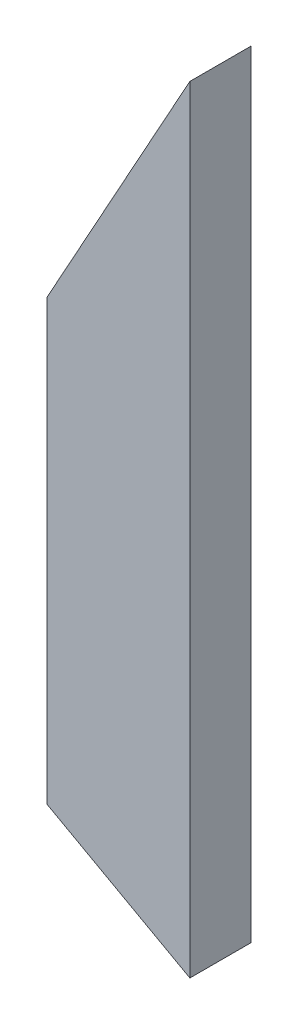
ISO-10303-21;
HEADER;
FILE_DESCRIPTION(('STEP AP214'),'2;1');
FILE_NAME('part.step','',(''),(''),'','','');
FILE_SCHEMA(('AUTOMOTIVE_DESIGN { 1 0 10303 214 1 1 1 1 }'));
ENDSEC;
DATA;
#1=APPLICATION_CONTEXT('core data for automotive mechanical design processes');
#2=APPLICATION_PROTOCOL_DEFINITION('international standard','automotive_design',2000,#1);
#3=PRODUCT_CONTEXT('',#1,'mechanical');
#4=PRODUCT('Part','Part','',(#3));
#5=PRODUCT_RELATED_PRODUCT_CATEGORY('part','',(#4));
#6=PRODUCT_DEFINITION_FORMATION('','',#4);
#7=PRODUCT_DEFINITION_CONTEXT('part definition',#1,'design');
#8=PRODUCT_DEFINITION('design','',#6,#7);
#9=PRODUCT_DEFINITION_SHAPE('','',#8);
#10=(LENGTH_UNIT() NAMED_UNIT(*) SI_UNIT(.MILLI.,.METRE.));
#11=(NAMED_UNIT(*) PLANE_ANGLE_UNIT() SI_UNIT($,.RADIAN.));
#12=(NAMED_UNIT(*) SI_UNIT($,.STERADIAN.) SOLID_ANGLE_UNIT());
#13=UNCERTAINTY_MEASURE_WITH_UNIT(LENGTH_MEASURE(1.E-05),#10,'distance_accuracy_value','');
#14=(GEOMETRIC_REPRESENTATION_CONTEXT(3) GLOBAL_UNCERTAINTY_ASSIGNED_CONTEXT((#13)) GLOBAL_UNIT_ASSIGNED_CONTEXT((#10,
#11,#12)) REPRESENTATION_CONTEXT('',''));
#15=CARTESIAN_POINT('',(0.,0.,0.));
#16=DIRECTION('',(0.,0.,1.));
#17=DIRECTION('',(1.,0.,0.));
#18=AXIS2_PLACEMENT_3D('',#15,#16,#17);
#19=CARTESIAN_POINT('',(-91.7985339074835,-165.915956747306,38.1));
#20=DIRECTION('',(-0.484122918275927,-0.875,0.));
#21=DIRECTION('',(0.875,-0.484122918275927,0.));
#22=AXIS2_PLACEMENT_3D('',#19,#20,#21);
#23=PLANE('',#22);
#24=DIRECTION('',(-0.875,0.484122918275927,0.));
#25=VECTOR('',#24,1.);
#26=CARTESIAN_POINT('',(-91.7985339074835,-165.915956747306,0.));
#27=LINE('',#26,#25);
#28=CARTESIAN_POINT('',(44.45,-241.3,0.));
#29=VERTEX_POINT('',#28);
#30=CARTESIAN_POINT('',(-44.45,-192.113111503166,0.));
#31=VERTEX_POINT('',#30);
#32=EDGE_CURVE('E101',#29,#31,#27,.T.);
#33=ORIENTED_EDGE('',*,*,#32,.F.);
#34=DIRECTION('',(0.,0.,-1.));
#35=VECTOR('',#34,1.);
#36=CARTESIAN_POINT('',(44.45,-241.3,38.1));
#37=LINE('',#36,#35);
#38=CARTESIAN_POINT('',(44.45,-241.3,38.1));
#39=VERTEX_POINT('',#38);
#40=EDGE_CURVE('E11',#39,#29,#37,.T.);
#41=ORIENTED_EDGE('',*,*,#40,.F.);
#42=DIRECTION('',(-0.875,0.484122918275927,0.));
#43=VECTOR('',#42,1.);
#44=CARTESIAN_POINT('',(-91.7985339074835,-165.915956747306,38.1));
#45=LINE('',#44,#43);
#46=CARTESIAN_POINT('',(-44.45,-192.113111503166,38.1));
#47=VERTEX_POINT('',#46);
#48=EDGE_CURVE('E95',#39,#47,#45,.T.);
#49=ORIENTED_EDGE('',*,*,#48,.T.);
#50=DIRECTION('',(0.,0.,-1.));
#51=VECTOR('',#50,1.);
#52=CARTESIAN_POINT('',(-44.45,-192.113111503166,38.1));
#53=LINE('',#52,#51);
#54=EDGE_CURVE('E76',#47,#31,#53,.T.);
#55=ORIENTED_EDGE('',*,*,#54,.T.);
#56=EDGE_LOOP('',(#33,#41,#49,#55));
#57=FACE_BOUND('',#56,.T.);
#58=ADVANCED_FACE('F38',(#57),#23,.T.);
#59=CARTESIAN_POINT('',(44.45,0.,38.1));
#60=DIRECTION('',(1.,0.,0.));
#61=DIRECTION('',(0.,1.,0.));
#62=AXIS2_PLACEMENT_3D('',#59,#60,#61);
#63=PLANE('',#62);
#64=DIRECTION('',(0.,-1.,0.));
#65=VECTOR('',#64,1.);
#66=CARTESIAN_POINT('',(44.45,0.,0.));
#67=LINE('',#66,#65);
#68=CARTESIAN_POINT('',(44.45,241.3,0.));
#69=VERTEX_POINT('',#68);
#70=EDGE_CURVE('E89',#69,#29,#67,.T.);
#71=ORIENTED_EDGE('',*,*,#70,.F.);
#72=DIRECTION('',(0.,0.,-1.));
#73=VECTOR('',#72,1.);
#74=CARTESIAN_POINT('',(44.45,241.3,38.1));
#75=LINE('',#74,#73);
#76=CARTESIAN_POINT('',(44.45,241.3,38.1));
#77=VERTEX_POINT('',#76);
#78=EDGE_CURVE('E46',#77,#69,#75,.T.);
#79=ORIENTED_EDGE('',*,*,#78,.F.);
#80=DIRECTION('',(0.,-1.,0.));
#81=VECTOR('',#80,1.);
#82=CARTESIAN_POINT('',(44.45,0.,38.1));
#83=LINE('',#82,#81);
#84=EDGE_CURVE('E87',#77,#39,#83,.T.);
#85=ORIENTED_EDGE('',*,*,#84,.T.);
#86=ORIENTED_EDGE('',*,*,#40,.T.);
#87=EDGE_LOOP('',(#71,#79,#85,#86));
#88=FACE_BOUND('',#87,.T.);
#89=ADVANCED_FACE('F85',(#88),#63,.T.);
#90=CARTESIAN_POINT('',(-68.1472767289676,37.6847981149753,38.1));
#91=DIRECTION('',(0.875108524693486,-0.483926719668164,0.));
#92=DIRECTION('',(0.483926719668165,0.875108524693486,0.));
#93=AXIS2_PLACEMENT_3D('',#90,#91,#92);
#94=PLANE('',#93);
#95=DIRECTION('',(-0.483926719668164,-0.875108524693486,0.));
#96=VECTOR('',#95,1.);
#97=CARTESIAN_POINT('',(-68.1472767289676,37.6847981149753,0.));
#98=LINE('',#97,#96);
#99=CARTESIAN_POINT('',(-44.45,80.5377509169207,0.));
#100=VERTEX_POINT('',#99);
#101=EDGE_CURVE('E69',#69,#100,#98,.T.);
#102=ORIENTED_EDGE('',*,*,#101,.T.);
#103=DIRECTION('',(0.,0.,-1.));
#104=VECTOR('',#103,1.);
#105=CARTESIAN_POINT('',(-44.45,80.5377509169207,38.1));
#106=LINE('',#105,#104);
#107=CARTESIAN_POINT('',(-44.45,80.5377509169207,38.1));
#108=VERTEX_POINT('',#107);
#109=EDGE_CURVE('E90',#108,#100,#106,.T.);
#110=ORIENTED_EDGE('',*,*,#109,.F.);
#111=DIRECTION('',(-0.483926719668164,-0.875108524693486,0.));
#112=VECTOR('',#111,1.);
#113=CARTESIAN_POINT('',(-68.1472767289676,37.6847981149753,38.1));
#114=LINE('',#113,#112);
#115=EDGE_CURVE('E91',#77,#108,#114,.T.);
#116=ORIENTED_EDGE('',*,*,#115,.F.);
#117=ORIENTED_EDGE('',*,*,#78,.T.);
#118=EDGE_LOOP('',(#102,#110,#116,#117));
#119=FACE_BOUND('',#118,.T.);
#120=ADVANCED_FACE('F92',(#119),#94,.F.);
#121=CARTESIAN_POINT('',(-44.45,0.,38.1));
#122=DIRECTION('',(1.,0.,0.));
#123=DIRECTION('',(0.,1.,0.));
#124=AXIS2_PLACEMENT_3D('',#121,#122,#123);
#125=PLANE('',#124);
#126=DIRECTION('',(0.,-1.,0.));
#127=VECTOR('',#126,1.);
#128=CARTESIAN_POINT('',(-44.45,0.,0.));
#129=LINE('',#128,#127);
#130=EDGE_CURVE('E97',#100,#31,#129,.T.);
#131=ORIENTED_EDGE('',*,*,#130,.T.);
#132=ORIENTED_EDGE('',*,*,#54,.F.);
#133=DIRECTION('',(0.,-1.,0.));
#134=VECTOR('',#133,1.);
#135=CARTESIAN_POINT('',(-44.45,0.,38.1));
#136=LINE('',#135,#134);
#137=EDGE_CURVE('E54',#108,#47,#136,.T.);
#138=ORIENTED_EDGE('',*,*,#137,.F.);
#139=ORIENTED_EDGE('',*,*,#109,.T.);
#140=EDGE_LOOP('',(#131,#132,#138,#139));
#141=FACE_BOUND('',#140,.T.);
#142=ADVANCED_FACE('F110',(#141),#125,.F.);
#143=CARTESIAN_POINT('',(0.,0.,38.1));
#144=DIRECTION('',(0.,0.,1.));
#145=DIRECTION('',(1.,0.,0.));
#146=AXIS2_PLACEMENT_3D('',#143,#144,#145);
#147=PLANE('',#146);
#148=ORIENTED_EDGE('',*,*,#48,.F.);
#149=ORIENTED_EDGE('',*,*,#84,.F.);
#150=ORIENTED_EDGE('',*,*,#115,.T.);
#151=ORIENTED_EDGE('',*,*,#137,.T.);
#152=EDGE_LOOP('',(#148,#149,#150,#151));
#153=FACE_BOUND('',#152,.T.);
#154=ADVANCED_FACE('F94',(#153),#147,.T.);
#155=CARTESIAN_POINT('',(0.,0.,0.));
#156=DIRECTION('',(0.,0.,1.));
#157=DIRECTION('',(1.,0.,0.));
#158=AXIS2_PLACEMENT_3D('',#155,#156,#157);
#159=PLANE('',#158);
#160=ORIENTED_EDGE('',*,*,#32,.T.);
#161=ORIENTED_EDGE('',*,*,#130,.F.);
#162=ORIENTED_EDGE('',*,*,#101,.F.);
#163=ORIENTED_EDGE('',*,*,#70,.T.);
#164=EDGE_LOOP('',(#160,#161,#162,#163));
#165=FACE_BOUND('',#164,.T.);
#166=ADVANCED_FACE('F112',(#165),#159,.F.);
#167=CLOSED_SHELL('',(#58,#89,#120,#142,#154,#166));
#168=MANIFOLD_SOLID_BREP('B2',#167);
#169=ADVANCED_BREP_SHAPE_REPRESENTATION('',(#18,#168),#14);
#170=SHAPE_DEFINITION_REPRESENTATION(#9,#169);
ENDSEC;
END-ISO-10303-21;
